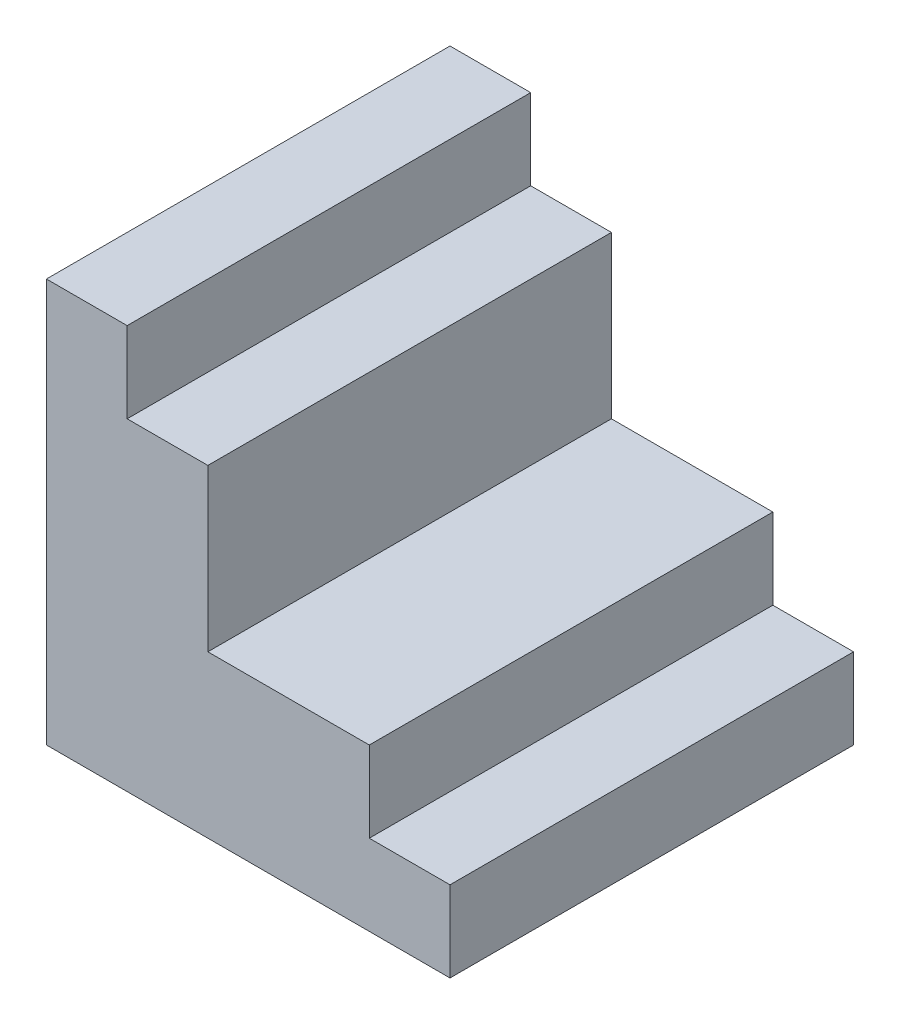
ISO-10303-21;
HEADER;
FILE_DESCRIPTION(('STEP AP214'),'2;1');
FILE_NAME('part.step','',(''),(''),'','','');
FILE_SCHEMA(('AUTOMOTIVE_DESIGN { 1 0 10303 214 1 1 1 1 }'));
ENDSEC;
DATA;
#1=APPLICATION_CONTEXT('core data for automotive mechanical design processes');
#2=APPLICATION_PROTOCOL_DEFINITION('international standard','automotive_design',2000,#1);
#3=PRODUCT_CONTEXT('',#1,'mechanical');
#4=PRODUCT('Part','Part','',(#3));
#5=PRODUCT_RELATED_PRODUCT_CATEGORY('part','',(#4));
#6=PRODUCT_DEFINITION_FORMATION('','',#4);
#7=PRODUCT_DEFINITION_CONTEXT('part definition',#1,'design');
#8=PRODUCT_DEFINITION('design','',#6,#7);
#9=PRODUCT_DEFINITION_SHAPE('','',#8);
#10=(LENGTH_UNIT() NAMED_UNIT(*) SI_UNIT(.MILLI.,.METRE.));
#11=(NAMED_UNIT(*) PLANE_ANGLE_UNIT() SI_UNIT($,.RADIAN.));
#12=(NAMED_UNIT(*) SI_UNIT($,.STERADIAN.) SOLID_ANGLE_UNIT());
#13=UNCERTAINTY_MEASURE_WITH_UNIT(LENGTH_MEASURE(1.E-05),#10,'distance_accuracy_value','');
#14=(GEOMETRIC_REPRESENTATION_CONTEXT(3) GLOBAL_UNCERTAINTY_ASSIGNED_CONTEXT((#13)) GLOBAL_UNIT_ASSIGNED_CONTEXT((#10,
#11,#12)) REPRESENTATION_CONTEXT('',''));
#15=CARTESIAN_POINT('',(0.,0.,0.));
#16=DIRECTION('',(0.,0.,1.));
#17=DIRECTION('',(1.,0.,0.));
#18=AXIS2_PLACEMENT_3D('',#15,#16,#17);
#19=CARTESIAN_POINT('',(-5.,10.,5.));
#20=DIRECTION('',(0.,-1.,0.));
#21=DIRECTION('',(0.,0.,-1.));
#22=AXIS2_PLACEMENT_3D('',#19,#20,#21);
#23=PLANE('',#22);
#24=DIRECTION('',(-1.,0.,0.));
#25=VECTOR('',#24,1.);
#26=CARTESIAN_POINT('',(-5.,10.,-5.));
#27=LINE('',#26,#25);
#28=CARTESIAN_POINT('',(-3.,10.,-5.));
#29=VERTEX_POINT('',#28);
#30=CARTESIAN_POINT('',(-5.,10.,-5.));
#31=VERTEX_POINT('',#30);
#32=EDGE_CURVE('E156',#29,#31,#27,.T.);
#33=ORIENTED_EDGE('',*,*,#32,.T.);
#34=DIRECTION('',(0.,0.,-1.));
#35=VECTOR('',#34,1.);
#36=CARTESIAN_POINT('',(-5.,10.,5.));
#37=LINE('',#36,#35);
#38=CARTESIAN_POINT('',(-5.,10.,5.));
#39=VERTEX_POINT('',#38);
#40=EDGE_CURVE('E11',#39,#31,#37,.T.);
#41=ORIENTED_EDGE('',*,*,#40,.F.);
#42=DIRECTION('',(-1.,0.,0.));
#43=VECTOR('',#42,1.);
#44=CARTESIAN_POINT('',(-5.,10.,5.));
#45=LINE('',#44,#43);
#46=CARTESIAN_POINT('',(-3.,10.,5.));
#47=VERTEX_POINT('',#46);
#48=EDGE_CURVE('E184',#47,#39,#45,.T.);
#49=ORIENTED_EDGE('',*,*,#48,.F.);
#50=DIRECTION('',(0.,0.,-1.));
#51=VECTOR('',#50,1.);
#52=CARTESIAN_POINT('',(-3.,10.,5.));
#53=LINE('',#52,#51);
#54=EDGE_CURVE('E152',#47,#29,#53,.T.);
#55=ORIENTED_EDGE('',*,*,#54,.T.);
#56=EDGE_LOOP('',(#33,#41,#49,#55));
#57=FACE_BOUND('',#56,.T.);
#58=ADVANCED_FACE('F43',(#57),#23,.F.);
#59=CARTESIAN_POINT('',(-5.,10.,5.));
#60=DIRECTION('',(1.,0.,0.));
#61=DIRECTION('',(0.,1.,0.));
#62=AXIS2_PLACEMENT_3D('',#59,#60,#61);
#63=PLANE('',#62);
#64=DIRECTION('',(0.,-1.,0.));
#65=VECTOR('',#64,1.);
#66=CARTESIAN_POINT('',(-5.,10.,-5.));
#67=LINE('',#66,#65);
#68=CARTESIAN_POINT('',(-5.,0.,-5.));
#69=VERTEX_POINT('',#68);
#70=EDGE_CURVE('E160',#31,#69,#67,.T.);
#71=ORIENTED_EDGE('',*,*,#70,.T.);
#72=DIRECTION('',(0.,0.,-1.));
#73=VECTOR('',#72,1.);
#74=CARTESIAN_POINT('',(-5.,0.,5.));
#75=LINE('',#74,#73);
#76=CARTESIAN_POINT('',(-5.,0.,5.));
#77=VERTEX_POINT('',#76);
#78=EDGE_CURVE('E52',#77,#69,#75,.T.);
#79=ORIENTED_EDGE('',*,*,#78,.F.);
#80=DIRECTION('',(0.,-1.,0.));
#81=VECTOR('',#80,1.);
#82=CARTESIAN_POINT('',(-5.,10.,5.));
#83=LINE('',#82,#81);
#84=EDGE_CURVE('E109',#39,#77,#83,.T.);
#85=ORIENTED_EDGE('',*,*,#84,.F.);
#86=ORIENTED_EDGE('',*,*,#40,.T.);
#87=EDGE_LOOP('',(#71,#79,#85,#86));
#88=FACE_BOUND('',#87,.T.);
#89=ADVANCED_FACE('F248',(#88),#63,.F.);
#90=CARTESIAN_POINT('',(-5.,0.,5.));
#91=DIRECTION('',(0.,1.,0.));
#92=DIRECTION('',(-1.,0.,0.));
#93=AXIS2_PLACEMENT_3D('',#90,#91,#92);
#94=PLANE('',#93);
#95=DIRECTION('',(1.,0.,0.));
#96=VECTOR('',#95,1.);
#97=CARTESIAN_POINT('',(-5.,0.,-5.));
#98=LINE('',#97,#96);
#99=CARTESIAN_POINT('',(5.,0.,-5.));
#100=VERTEX_POINT('',#99);
#101=EDGE_CURVE('E163',#69,#100,#98,.T.);
#102=ORIENTED_EDGE('',*,*,#101,.T.);
#103=DIRECTION('',(0.,0.,-1.));
#104=VECTOR('',#103,1.);
#105=CARTESIAN_POINT('',(5.,0.,5.));
#106=LINE('',#105,#104);
#107=CARTESIAN_POINT('',(5.,0.,5.));
#108=VERTEX_POINT('',#107);
#109=EDGE_CURVE('E203',#108,#100,#106,.T.);
#110=ORIENTED_EDGE('',*,*,#109,.F.);
#111=DIRECTION('',(1.,0.,0.));
#112=VECTOR('',#111,1.);
#113=CARTESIAN_POINT('',(-5.,0.,5.));
#114=LINE('',#113,#112);
#115=EDGE_CURVE('E213',#77,#108,#114,.T.);
#116=ORIENTED_EDGE('',*,*,#115,.F.);
#117=ORIENTED_EDGE('',*,*,#78,.T.);
#118=EDGE_LOOP('',(#102,#110,#116,#117));
#119=FACE_BOUND('',#118,.T.);
#120=ADVANCED_FACE('F211',(#119),#94,.F.);
#121=CARTESIAN_POINT('',(5.,2.,5.));
#122=DIRECTION('',(-1.,0.,0.));
#123=DIRECTION('',(0.,-1.,0.));
#124=AXIS2_PLACEMENT_3D('',#121,#122,#123);
#125=PLANE('',#124);
#126=DIRECTION('',(0.,1.,0.));
#127=VECTOR('',#126,1.);
#128=CARTESIAN_POINT('',(5.,2.,-5.));
#129=LINE('',#128,#127);
#130=CARTESIAN_POINT('',(5.,2.,-5.));
#131=VERTEX_POINT('',#130);
#132=EDGE_CURVE('E166',#100,#131,#129,.T.);
#133=ORIENTED_EDGE('',*,*,#132,.T.);
#134=DIRECTION('',(0.,0.,-1.));
#135=VECTOR('',#134,1.);
#136=CARTESIAN_POINT('',(5.,2.,5.));
#137=LINE('',#136,#135);
#138=CARTESIAN_POINT('',(5.,2.,5.));
#139=VERTEX_POINT('',#138);
#140=EDGE_CURVE('E199',#139,#131,#137,.T.);
#141=ORIENTED_EDGE('',*,*,#140,.F.);
#142=DIRECTION('',(0.,1.,0.));
#143=VECTOR('',#142,1.);
#144=CARTESIAN_POINT('',(5.,2.,5.));
#145=LINE('',#144,#143);
#146=EDGE_CURVE('E232',#108,#139,#145,.T.);
#147=ORIENTED_EDGE('',*,*,#146,.F.);
#148=ORIENTED_EDGE('',*,*,#109,.T.);
#149=EDGE_LOOP('',(#133,#141,#147,#148));
#150=FACE_BOUND('',#149,.T.);
#151=ADVANCED_FACE('F222',(#150),#125,.F.);
#152=CARTESIAN_POINT('',(3.,2.,5.));
#153=DIRECTION('',(0.,-1.,0.));
#154=DIRECTION('',(0.,0.,-1.));
#155=AXIS2_PLACEMENT_3D('',#152,#153,#154);
#156=PLANE('',#155);
#157=DIRECTION('',(-1.,0.,0.));
#158=VECTOR('',#157,1.);
#159=CARTESIAN_POINT('',(3.,2.,-5.));
#160=LINE('',#159,#158);
#161=CARTESIAN_POINT('',(3.,2.,-5.));
#162=VERTEX_POINT('',#161);
#163=EDGE_CURVE('E169',#131,#162,#160,.T.);
#164=ORIENTED_EDGE('',*,*,#163,.T.);
#165=DIRECTION('',(0.,0.,-1.));
#166=VECTOR('',#165,1.);
#167=CARTESIAN_POINT('',(3.,2.,5.));
#168=LINE('',#167,#166);
#169=CARTESIAN_POINT('',(3.,2.,5.));
#170=VERTEX_POINT('',#169);
#171=EDGE_CURVE('E195',#170,#162,#168,.T.);
#172=ORIENTED_EDGE('',*,*,#171,.F.);
#173=DIRECTION('',(-1.,0.,0.));
#174=VECTOR('',#173,1.);
#175=CARTESIAN_POINT('',(3.,2.,5.));
#176=LINE('',#175,#174);
#177=EDGE_CURVE('E228',#139,#170,#176,.T.);
#178=ORIENTED_EDGE('',*,*,#177,.F.);
#179=ORIENTED_EDGE('',*,*,#140,.T.);
#180=EDGE_LOOP('',(#164,#172,#178,#179));
#181=FACE_BOUND('',#180,.T.);
#182=ADVANCED_FACE('F226',(#181),#156,.F.);
#183=CARTESIAN_POINT('',(3.,4.,5.));
#184=DIRECTION('',(-1.,0.,0.));
#185=DIRECTION('',(0.,-1.,0.));
#186=AXIS2_PLACEMENT_3D('',#183,#184,#185);
#187=PLANE('',#186);
#188=DIRECTION('',(0.,1.,0.));
#189=VECTOR('',#188,1.);
#190=CARTESIAN_POINT('',(3.,4.,-5.));
#191=LINE('',#190,#189);
#192=CARTESIAN_POINT('',(3.,4.,-5.));
#193=VERTEX_POINT('',#192);
#194=EDGE_CURVE('E172',#162,#193,#191,.T.);
#195=ORIENTED_EDGE('',*,*,#194,.T.);
#196=DIRECTION('',(0.,0.,-1.));
#197=VECTOR('',#196,1.);
#198=CARTESIAN_POINT('',(3.,4.,5.));
#199=LINE('',#198,#197);
#200=CARTESIAN_POINT('',(3.,4.,5.));
#201=VERTEX_POINT('',#200);
#202=EDGE_CURVE('E191',#201,#193,#199,.T.);
#203=ORIENTED_EDGE('',*,*,#202,.F.);
#204=DIRECTION('',(0.,1.,0.));
#205=VECTOR('',#204,1.);
#206=CARTESIAN_POINT('',(3.,4.,5.));
#207=LINE('',#206,#205);
#208=EDGE_CURVE('E231',#170,#201,#207,.T.);
#209=ORIENTED_EDGE('',*,*,#208,.F.);
#210=ORIENTED_EDGE('',*,*,#171,.T.);
#211=EDGE_LOOP('',(#195,#203,#209,#210));
#212=FACE_BOUND('',#211,.T.);
#213=ADVANCED_FACE('F260',(#212),#187,.F.);
#214=CARTESIAN_POINT('',(-1.,4.,5.));
#215=DIRECTION('',(0.,-1.,0.));
#216=DIRECTION('',(0.,0.,-1.));
#217=AXIS2_PLACEMENT_3D('',#214,#215,#216);
#218=PLANE('',#217);
#219=DIRECTION('',(-1.,0.,0.));
#220=VECTOR('',#219,1.);
#221=CARTESIAN_POINT('',(-1.,4.,-5.));
#222=LINE('',#221,#220);
#223=CARTESIAN_POINT('',(-1.,4.,-5.));
#224=VERTEX_POINT('',#223);
#225=EDGE_CURVE('E175',#193,#224,#222,.T.);
#226=ORIENTED_EDGE('',*,*,#225,.T.);
#227=DIRECTION('',(0.,0.,-1.));
#228=VECTOR('',#227,1.);
#229=CARTESIAN_POINT('',(-1.,4.,5.));
#230=LINE('',#229,#228);
#231=CARTESIAN_POINT('',(-1.,4.,5.));
#232=VERTEX_POINT('',#231);
#233=EDGE_CURVE('E145',#232,#224,#230,.T.);
#234=ORIENTED_EDGE('',*,*,#233,.F.);
#235=DIRECTION('',(-1.,0.,0.));
#236=VECTOR('',#235,1.);
#237=CARTESIAN_POINT('',(-1.,4.,5.));
#238=LINE('',#237,#236);
#239=EDGE_CURVE('E134',#201,#232,#238,.T.);
#240=ORIENTED_EDGE('',*,*,#239,.F.);
#241=ORIENTED_EDGE('',*,*,#202,.T.);
#242=EDGE_LOOP('',(#226,#234,#240,#241));
#243=FACE_BOUND('',#242,.T.);
#244=ADVANCED_FACE('F263',(#243),#218,.F.);
#245=CARTESIAN_POINT('',(-1.,8.,5.));
#246=DIRECTION('',(-1.,0.,0.));
#247=DIRECTION('',(0.,-1.,0.));
#248=AXIS2_PLACEMENT_3D('',#245,#246,#247);
#249=PLANE('',#248);
#250=DIRECTION('',(0.,1.,0.));
#251=VECTOR('',#250,1.);
#252=CARTESIAN_POINT('',(-1.,8.,-5.));
#253=LINE('',#252,#251);
#254=CARTESIAN_POINT('',(-1.,8.,-5.));
#255=VERTEX_POINT('',#254);
#256=EDGE_CURVE('E143',#224,#255,#253,.T.);
#257=ORIENTED_EDGE('',*,*,#256,.T.);
#258=DIRECTION('',(0.,0.,-1.));
#259=VECTOR('',#258,1.);
#260=CARTESIAN_POINT('',(-1.,8.,5.));
#261=LINE('',#260,#259);
#262=CARTESIAN_POINT('',(-1.,8.,5.));
#263=VERTEX_POINT('',#262);
#264=EDGE_CURVE('E140',#263,#255,#261,.T.);
#265=ORIENTED_EDGE('',*,*,#264,.F.);
#266=DIRECTION('',(0.,1.,0.));
#267=VECTOR('',#266,1.);
#268=CARTESIAN_POINT('',(-1.,8.,5.));
#269=LINE('',#268,#267);
#270=EDGE_CURVE('E128',#232,#263,#269,.T.);
#271=ORIENTED_EDGE('',*,*,#270,.F.);
#272=ORIENTED_EDGE('',*,*,#233,.T.);
#273=EDGE_LOOP('',(#257,#265,#271,#272));
#274=FACE_BOUND('',#273,.T.);
#275=ADVANCED_FACE('F141',(#274),#249,.F.);
#276=CARTESIAN_POINT('',(-3.,8.,5.));
#277=DIRECTION('',(0.,-1.,0.));
#278=DIRECTION('',(0.,0.,-1.));
#279=AXIS2_PLACEMENT_3D('',#276,#277,#278);
#280=PLANE('',#279);
#281=DIRECTION('',(-1.,0.,0.));
#282=VECTOR('',#281,1.);
#283=CARTESIAN_POINT('',(-3.,8.,-5.));
#284=LINE('',#283,#282);
#285=CARTESIAN_POINT('',(-3.,8.,-5.));
#286=VERTEX_POINT('',#285);
#287=EDGE_CURVE('E95',#255,#286,#284,.T.);
#288=ORIENTED_EDGE('',*,*,#287,.T.);
#289=DIRECTION('',(0.,0.,-1.));
#290=VECTOR('',#289,1.);
#291=CARTESIAN_POINT('',(-3.,8.,5.));
#292=LINE('',#291,#290);
#293=CARTESIAN_POINT('',(-3.,8.,5.));
#294=VERTEX_POINT('',#293);
#295=EDGE_CURVE('E146',#294,#286,#292,.T.);
#296=ORIENTED_EDGE('',*,*,#295,.F.);
#297=DIRECTION('',(-1.,0.,0.));
#298=VECTOR('',#297,1.);
#299=CARTESIAN_POINT('',(-3.,8.,5.));
#300=LINE('',#299,#298);
#301=EDGE_CURVE('E132',#263,#294,#300,.T.);
#302=ORIENTED_EDGE('',*,*,#301,.F.);
#303=ORIENTED_EDGE('',*,*,#264,.T.);
#304=EDGE_LOOP('',(#288,#296,#302,#303));
#305=FACE_BOUND('',#304,.T.);
#306=ADVANCED_FACE('F148',(#305),#280,.F.);
#307=CARTESIAN_POINT('',(-3.,10.,5.));
#308=DIRECTION('',(-1.,0.,0.));
#309=DIRECTION('',(0.,-1.,0.));
#310=AXIS2_PLACEMENT_3D('',#307,#308,#309);
#311=PLANE('',#310);
#312=DIRECTION('',(0.,1.,0.));
#313=VECTOR('',#312,1.);
#314=CARTESIAN_POINT('',(-3.,10.,-5.));
#315=LINE('',#314,#313);
#316=EDGE_CURVE('E101',#286,#29,#315,.T.);
#317=ORIENTED_EDGE('',*,*,#316,.T.);
#318=ORIENTED_EDGE('',*,*,#54,.F.);
#319=DIRECTION('',(0.,1.,0.));
#320=VECTOR('',#319,1.);
#321=CARTESIAN_POINT('',(-3.,10.,5.));
#322=LINE('',#321,#320);
#323=EDGE_CURVE('E60',#294,#47,#322,.T.);
#324=ORIENTED_EDGE('',*,*,#323,.F.);
#325=ORIENTED_EDGE('',*,*,#295,.T.);
#326=EDGE_LOOP('',(#317,#318,#324,#325));
#327=FACE_BOUND('',#326,.T.);
#328=ADVANCED_FACE('F272',(#327),#311,.F.);
#329=CARTESIAN_POINT('',(0.,0.,5.));
#330=DIRECTION('',(0.,0.,-1.));
#331=DIRECTION('',(-1.,0.,0.));
#332=AXIS2_PLACEMENT_3D('',#329,#330,#331);
#333=PLANE('',#332);
#334=ORIENTED_EDGE('',*,*,#48,.T.);
#335=ORIENTED_EDGE('',*,*,#84,.T.);
#336=ORIENTED_EDGE('',*,*,#115,.T.);
#337=ORIENTED_EDGE('',*,*,#146,.T.);
#338=ORIENTED_EDGE('',*,*,#177,.T.);
#339=ORIENTED_EDGE('',*,*,#208,.T.);
#340=ORIENTED_EDGE('',*,*,#239,.T.);
#341=ORIENTED_EDGE('',*,*,#270,.T.);
#342=ORIENTED_EDGE('',*,*,#301,.T.);
#343=ORIENTED_EDGE('',*,*,#323,.T.);
#344=EDGE_LOOP('',(#334,#335,#336,#337,#338,#339,#340,#341,#342,#343));
#345=FACE_BOUND('',#344,.T.);
#346=ADVANCED_FACE('F130',(#345),#333,.F.);
#347=CARTESIAN_POINT('',(0.,0.,-5.));
#348=DIRECTION('',(0.,0.,-1.));
#349=DIRECTION('',(-1.,0.,0.));
#350=AXIS2_PLACEMENT_3D('',#347,#348,#349);
#351=PLANE('',#350);
#352=ORIENTED_EDGE('',*,*,#32,.F.);
#353=ORIENTED_EDGE('',*,*,#316,.F.);
#354=ORIENTED_EDGE('',*,*,#287,.F.);
#355=ORIENTED_EDGE('',*,*,#256,.F.);
#356=ORIENTED_EDGE('',*,*,#225,.F.);
#357=ORIENTED_EDGE('',*,*,#194,.F.);
#358=ORIENTED_EDGE('',*,*,#163,.F.);
#359=ORIENTED_EDGE('',*,*,#132,.F.);
#360=ORIENTED_EDGE('',*,*,#101,.F.);
#361=ORIENTED_EDGE('',*,*,#70,.F.);
#362=EDGE_LOOP('',(#352,#353,#354,#355,#356,#357,#358,#359,#360,#361));
#363=FACE_BOUND('',#362,.T.);
#364=ADVANCED_FACE('F217',(#363),#351,.T.);
#365=CLOSED_SHELL('',(#58,#89,#120,#151,#182,#213,#244,#275,#306,#328,#346,#364));
#366=MANIFOLD_SOLID_BREP('B2',#365);
#367=ADVANCED_BREP_SHAPE_REPRESENTATION('',(#18,#366),#14);
#368=SHAPE_DEFINITION_REPRESENTATION(#9,#367);
ENDSEC;
END-ISO-10303-21;
